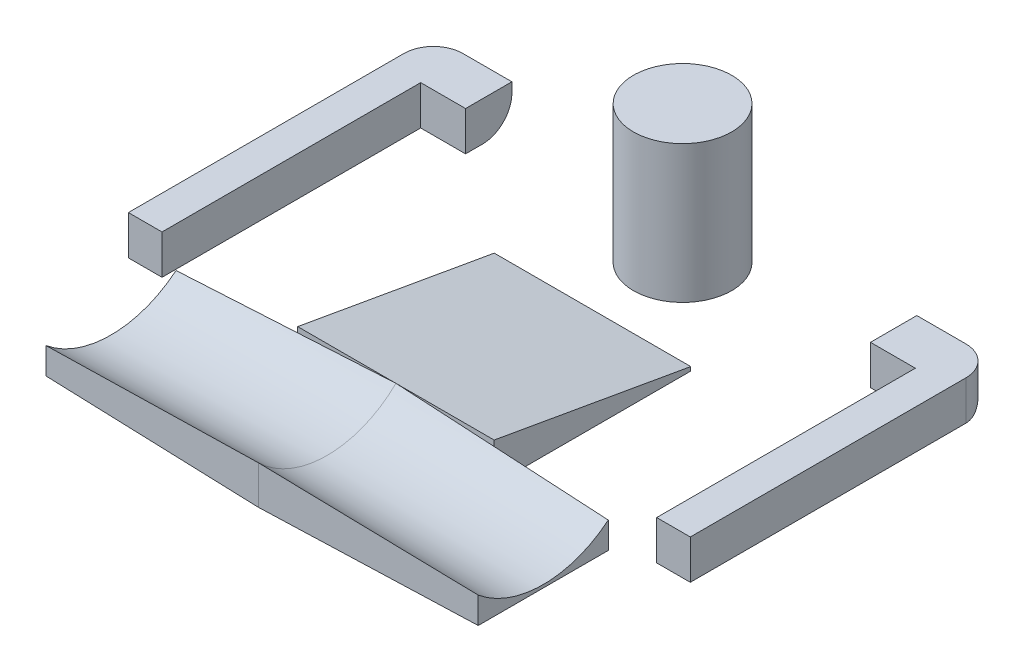
ISO-10303-21;
HEADER;
FILE_DESCRIPTION(('STEP AP214'),'2;1');
FILE_NAME('part.step','',(''),(''),'','','');
FILE_SCHEMA(('AUTOMOTIVE_DESIGN { 1 0 10303 214 1 1 1 1 }'));
ENDSEC;
DATA;
#1=APPLICATION_CONTEXT('core data for automotive mechanical design processes');
#2=APPLICATION_PROTOCOL_DEFINITION('international standard','automotive_design',2000,#1);
#3=PRODUCT_CONTEXT('',#1,'mechanical');
#4=PRODUCT('Part','Part','',(#3));
#5=PRODUCT_RELATED_PRODUCT_CATEGORY('part','',(#4));
#6=PRODUCT_DEFINITION_FORMATION('','',#4);
#7=PRODUCT_DEFINITION_CONTEXT('part definition',#1,'design');
#8=PRODUCT_DEFINITION('design','',#6,#7);
#9=PRODUCT_DEFINITION_SHAPE('','',#8);
#10=(LENGTH_UNIT() NAMED_UNIT(*) SI_UNIT(.MILLI.,.METRE.));
#11=(NAMED_UNIT(*) PLANE_ANGLE_UNIT() SI_UNIT($,.RADIAN.));
#12=(NAMED_UNIT(*) SI_UNIT($,.STERADIAN.) SOLID_ANGLE_UNIT());
#13=UNCERTAINTY_MEASURE_WITH_UNIT(LENGTH_MEASURE(1.E-05),#10,'distance_accuracy_value','');
#14=(GEOMETRIC_REPRESENTATION_CONTEXT(3) GLOBAL_UNCERTAINTY_ASSIGNED_CONTEXT((#13)) GLOBAL_UNIT_ASSIGNED_CONTEXT((#10,
#11,#12)) REPRESENTATION_CONTEXT('',''));
#15=CARTESIAN_POINT('',(0.,0.,0.));
#16=DIRECTION('',(0.,0.,1.));
#17=DIRECTION('',(1.,0.,0.));
#18=AXIS2_PLACEMENT_3D('',#15,#16,#17);
#19=CARTESIAN_POINT('',(0.,19.6439911719342,-86.2522820777331));
#20=DIRECTION('',(-0.0174524064372835,0.,-0.999847695156391));
#21=DIRECTION('',(-0.999847695156391,0.,0.0174524064372835));
#22=AXIS2_PLACEMENT_3D('',#19,#20,#21);
#23=PLANE('',#22);
#24=DIRECTION('',(0.,1.,0.));
#25=VECTOR('',#24,1.);
#26=CARTESIAN_POINT('',(0.,19.6439911719342,-86.2522820777331));
#27=LINE('',#26,#25);
#28=CARTESIAN_POINT('',(0.,0.,-86.2522820777331));
#29=VERTEX_POINT('',#28);
#30=CARTESIAN_POINT('',(0.,19.6439911719342,-86.2522820777331));
#31=VERTEX_POINT('',#30);
#32=EDGE_CURVE('E111',#29,#31,#27,.T.);
#33=ORIENTED_EDGE('',*,*,#32,.F.);
#34=DIRECTION('',(0.999695459881887,-0.0174497491606827,-0.0174497491606827));
#35=VECTOR('',#34,1.);
#36=CARTESIAN_POINT('',(0.,0.,-86.2522820777331));
#37=LINE('',#36,#35);
#38=CARTESIAN_POINT('',(-110.,1.92005714210394,-84.3322249356291));
#39=VERTEX_POINT('',#38);
#40=EDGE_CURVE('E12',#39,#29,#37,.T.);
#41=ORIENTED_EDGE('',*,*,#40,.F.);
#42=DIRECTION('',(0.,1.,0.));
#43=VECTOR('',#42,1.);
#44=CARTESIAN_POINT('',(-110.,55.3414805364965,-84.3322249356291));
#45=LINE('',#44,#43);
#46=CARTESIAN_POINT('',(-110.,15.3320033173084,-84.3322249356291));
#47=VERTEX_POINT('',#46);
#48=EDGE_CURVE('E134',#39,#47,#45,.T.);
#49=ORIENTED_EDGE('',*,*,#48,.T.);
#50=CARTESIAN_POINT('',(-110.,15.3320033173084,-84.3322249356291));
#51=CARTESIAN_POINT('',(-100.832584284601,15.6720161374856,-84.4922427721654));
#52=CARTESIAN_POINT('',(-91.6653270800063,16.0163249939476,-84.6522578418853));
#53=CARTESIAN_POINT('',(-73.3311807847771,16.7143120486609,-84.9722815558719));
#54=CARTESIAN_POINT('',(-64.1642916937,17.0679902352812,-85.1322902001464));
#55=CARTESIAN_POINT('',(-45.8309090448973,17.7854940955446,-85.4523005846352));
#56=CARTESIAN_POINT('',(-36.6644154872111,18.1493197701983,-85.6123023248487));
#57=CARTESIAN_POINT('',(-18.331864767641,18.8880818308203,-85.9322981879586));
#58=CARTESIAN_POINT('',(-9.16580760631306,19.2630182305842,-86.0922923108453));
#59=CARTESIAN_POINT('',(0.,19.6439911719342,-86.2522820777331));
#60=B_SPLINE_CURVE_WITH_KNOTS('',3,(#50,#51,#52,#53,#54,#55,#56,#57,#58,#59),.UNSPECIFIED.,.F.,
.F.,(4,2,2,2,4),(0.,27.5253434774323,55.0506527865783,82.5759648373009,110.101311066293),.UNSPECIFIED.);
#61=EDGE_CURVE('E89',#47,#31,#60,.T.);
#62=ORIENTED_EDGE('',*,*,#61,.T.);
#63=EDGE_LOOP('',(#33,#41,#49,#62));
#64=FACE_BOUND('',#63,.T.);
#65=ADVANCED_FACE('F52',(#64),#23,.T.);
#66=CARTESIAN_POINT('',(0.,0.,-86.2522820777331));
#67=DIRECTION('',(-0.0174524064372835,-0.999847695156391,0.));
#68=DIRECTION('',(0.999847695156391,-0.0174524064372835,0.));
#69=AXIS2_PLACEMENT_3D('',#66,#67,#68);
#70=PLANE('',#69);
#71=DIRECTION('',(0.,0.,-1.));
#72=VECTOR('',#71,1.);
#73=CARTESIAN_POINT('',(0.,0.,-86.2522820777331));
#74=LINE('',#73,#72);
#75=CARTESIAN_POINT('',(0.,0.,-16.23259190227));
#76=VERTEX_POINT('',#75);
#77=EDGE_CURVE('E121',#76,#29,#74,.T.);
#78=ORIENTED_EDGE('',*,*,#77,.F.);
#79=DIRECTION('',(0.999695459881887,-0.0174497491606827,0.0174497491606827));
#80=VECTOR('',#79,1.);
#81=CARTESIAN_POINT('',(0.,0.,-16.23259190227));
#82=LINE('',#81,#80);
#83=CARTESIAN_POINT('',(-110.,1.92005714210393,-18.1526490443739));
#84=VERTEX_POINT('',#83);
#85=EDGE_CURVE('E62',#84,#76,#82,.T.);
#86=ORIENTED_EDGE('',*,*,#85,.F.);
#87=DIRECTION('',(0.,0.,-1.));
#88=VECTOR('',#87,1.);
#89=CARTESIAN_POINT('',(-110.,1.92005714210394,-51.2424369900015));
#90=LINE('',#89,#88);
#91=EDGE_CURVE('E124',#84,#39,#90,.T.);
#92=ORIENTED_EDGE('',*,*,#91,.T.);
#93=ORIENTED_EDGE('',*,*,#40,.T.);
#94=EDGE_LOOP('',(#78,#86,#92,#93));
#95=FACE_BOUND('',#94,.T.);
#96=ADVANCED_FACE('F54',(#95),#70,.T.);
#97=CARTESIAN_POINT('',(0.,0.,-16.23259190227));
#98=DIRECTION('',(-0.0174524064372835,0.,0.999847695156391));
#99=DIRECTION('',(0.999847695156391,0.,0.0174524064372835));
#100=AXIS2_PLACEMENT_3D('',#97,#98,#99);
#101=PLANE('',#100);
#102=DIRECTION('',(0.,-1.,0.));
#103=VECTOR('',#102,1.);
#104=CARTESIAN_POINT('',(0.,0.,-16.23259190227));
#105=LINE('',#104,#103);
#106=CARTESIAN_POINT('',(0.,19.6439911719342,-16.23259190227));
#107=VERTEX_POINT('',#106);
#108=EDGE_CURVE('E135',#107,#76,#105,.T.);
#109=ORIENTED_EDGE('',*,*,#108,.F.);
#110=CARTESIAN_POINT('',(-110.,15.3320033173084,-18.1526490443739));
#111=CARTESIAN_POINT('',(-100.832584284601,15.6720161374856,-17.9926312078377));
#112=CARTESIAN_POINT('',(-91.6653270800063,16.0163249939476,-17.8326161381178));
#113=CARTESIAN_POINT('',(-73.3311807847771,16.7143120486609,-17.5125924241311));
#114=CARTESIAN_POINT('',(-64.1642916937,17.0679902352812,-17.3525837798566));
#115=CARTESIAN_POINT('',(-45.8309090448973,17.7854940955445,-17.0325733953679));
#116=CARTESIAN_POINT('',(-36.6644154872111,18.1493197701983,-16.8725716551544));
#117=CARTESIAN_POINT('',(-18.331864767641,18.8880818308203,-16.5525757920445));
#118=CARTESIAN_POINT('',(-9.16580760631306,19.2630182305842,-16.3925816691577));
#119=CARTESIAN_POINT('',(0.,19.6439911719342,-16.23259190227));
#120=B_SPLINE_CURVE_WITH_KNOTS('',3,(#110,#111,#112,#113,#114,#115,#116,#117,#118,#119),
.UNSPECIFIED.,.F.,.F.,(4,2,2,2,4),(0.,27.5253434774323,55.0506527865783,82.5759648373009,
110.101311066293),.UNSPECIFIED.);
#121=CARTESIAN_POINT('',(-110.,15.3320033173084,-18.1526490443739));
#122=VERTEX_POINT('',#121);
#123=EDGE_CURVE('E82',#122,#107,#120,.T.);
#124=ORIENTED_EDGE('',*,*,#123,.F.);
#125=DIRECTION('',(0.,-1.,0.));
#126=VECTOR('',#125,1.);
#127=CARTESIAN_POINT('',(-110.,55.3414805364965,-18.1526490443739));
#128=LINE('',#127,#126);
#129=EDGE_CURVE('E295',#122,#84,#128,.T.);
#130=ORIENTED_EDGE('',*,*,#129,.T.);
#131=ORIENTED_EDGE('',*,*,#85,.T.);
#132=EDGE_LOOP('',(#109,#124,#130,#131));
#133=FACE_BOUND('',#132,.T.);
#134=ADVANCED_FACE('F186',(#133),#101,.T.);
#135=CARTESIAN_POINT('',(0.,55.3414805364965,-51.2424369900015));
#136=DIRECTION('',(-1.,0.,0.));
#137=DIRECTION('',(0.,0.,-1.));
#138=AXIS2_PLACEMENT_3D('',#135,#136,#137);
#139=CONICAL_SURFACE('',#138,50.,0.0174532925199433);
#140=CARTESIAN_POINT('',(0.,55.3414805364965,-51.2424369900015));
#141=DIRECTION('',(-1.,0.,0.));
#142=DIRECTION('',(0.,0.,-1.));
#143=AXIS2_PLACEMENT_3D('',#140,#141,#142);
#144=CIRCLE('',#143,50.);
#145=EDGE_CURVE('E115',#31,#107,#144,.T.);
#146=ORIENTED_EDGE('',*,*,#145,.F.);
#147=ORIENTED_EDGE('',*,*,#61,.F.);
#148=CARTESIAN_POINT('',(-110.,55.3414805364965,-51.2424369900015));
#149=DIRECTION('',(1.,0.,0.));
#150=DIRECTION('',(0.,0.,-1.));
#151=AXIS2_PLACEMENT_3D('',#148,#149,#150);
#152=CIRCLE('',#151,51.9200571421039);
#153=EDGE_CURVE('E56',#47,#122,#152,.F.);
#154=ORIENTED_EDGE('',*,*,#153,.T.);
#155=ORIENTED_EDGE('',*,*,#123,.T.);
#156=EDGE_LOOP('',(#146,#147,#154,#155));
#157=FACE_BOUND('',#156,.T.);
#158=ADVANCED_FACE('F178',(#157),#139,.F.);
#159=CARTESIAN_POINT('',(-110.,55.3414805364965,-51.2424369900015));
#160=DIRECTION('',(1.,0.,0.));
#161=DIRECTION('',(0.,0.,-1.));
#162=AXIS2_PLACEMENT_3D('',#159,#160,#161);
#163=PLANE('',#162);
#164=ORIENTED_EDGE('',*,*,#48,.F.);
#165=ORIENTED_EDGE('',*,*,#91,.F.);
#166=ORIENTED_EDGE('',*,*,#129,.F.);
#167=ORIENTED_EDGE('',*,*,#153,.F.);
#168=EDGE_LOOP('',(#164,#165,#166,#167));
#169=FACE_BOUND('',#168,.T.);
#170=ADVANCED_FACE('F174',(#169),#163,.F.);
#171=CARTESIAN_POINT('',(0.,19.6439911719342,-86.2522820777331));
#172=DIRECTION('',(0.0174524064372835,0.,-0.999847695156391));
#173=DIRECTION('',(-0.999847695156391,0.,-0.0174524064372835));
#174=AXIS2_PLACEMENT_3D('',#171,#172,#173);
#175=PLANE('',#174);
#176=ORIENTED_EDGE('',*,*,#32,.T.);
#177=CARTESIAN_POINT('',(110.,15.3320033173084,-84.3322249356291));
#178=CARTESIAN_POINT('',(100.832584284601,15.6720161374856,-84.4922427721654));
#179=CARTESIAN_POINT('',(91.6653270800063,16.0163249939476,-84.6522578418853));
#180=CARTESIAN_POINT('',(73.3311807847771,16.7143120486609,-84.9722815558719));
#181=CARTESIAN_POINT('',(64.1642916937,17.0679902352812,-85.1322902001464));
#182=CARTESIAN_POINT('',(45.8309090448973,17.7854940955446,-85.4523005846352));
#183=CARTESIAN_POINT('',(36.6644154872111,18.1493197701983,-85.6123023248487));
#184=CARTESIAN_POINT('',(18.331864767641,18.8880818308203,-85.9322981879586));
#185=CARTESIAN_POINT('',(9.16580760631306,19.2630182305842,-86.0922923108453));
#186=CARTESIAN_POINT('',(0.,19.6439911719342,-86.2522820777331));
#187=B_SPLINE_CURVE_WITH_KNOTS('',3,(#177,#178,#179,#180,#181,#182,#183,#184,#185,#186),
.UNSPECIFIED.,.F.,.F.,(4,2,2,2,4),(0.,27.5253434774323,55.0506527865783,82.5759648373009,
110.101311066293),.UNSPECIFIED.);
#188=CARTESIAN_POINT('',(110.,15.3320033173084,-84.3322249356291));
#189=VERTEX_POINT('',#188);
#190=EDGE_CURVE('E116',#189,#31,#187,.T.);
#191=ORIENTED_EDGE('',*,*,#190,.F.);
#192=DIRECTION('',(0.,-1.,0.));
#193=VECTOR('',#192,1.);
#194=CARTESIAN_POINT('',(110.,19.6439911719342,-84.3322249356291));
#195=LINE('',#194,#193);
#196=CARTESIAN_POINT('',(110.,1.92005714210394,-84.3322249356291));
#197=VERTEX_POINT('',#196);
#198=EDGE_CURVE('E139',#197,#189,#195,.F.);
#199=ORIENTED_EDGE('',*,*,#198,.F.);
#200=DIRECTION('',(-0.999695459881887,-0.0174497491606827,-0.0174497491606827));
#201=VECTOR('',#200,1.);
#202=CARTESIAN_POINT('',(0.34267832737535,0.00598147245383165,-86.2463006052792));
#203=LINE('',#202,#201);
#204=EDGE_CURVE('E130',#197,#29,#203,.T.);
#205=ORIENTED_EDGE('',*,*,#204,.T.);
#206=EDGE_LOOP('',(#176,#191,#199,#205));
#207=FACE_BOUND('',#206,.T.);
#208=ADVANCED_FACE('F137',(#207),#175,.T.);
#209=CARTESIAN_POINT('',(0.,55.3414805364965,-51.2424369900015));
#210=DIRECTION('',(1.,0.,0.));
#211=DIRECTION('',(0.,0.,-1.));
#212=AXIS2_PLACEMENT_3D('',#209,#210,#211);
#213=CONICAL_SURFACE('',#212,50.,0.0174532925199433);
#214=ORIENTED_EDGE('',*,*,#145,.T.);
#215=CARTESIAN_POINT('',(110.,15.3320033173084,-18.1526490443739));
#216=CARTESIAN_POINT('',(100.832584284601,15.6720161374856,-17.9926312078377));
#217=CARTESIAN_POINT('',(91.6653270800063,16.0163249939476,-17.8326161381178));
#218=CARTESIAN_POINT('',(73.3311807847771,16.7143120486609,-17.5125924241311));
#219=CARTESIAN_POINT('',(64.1642916937,17.0679902352812,-17.3525837798566));
#220=CARTESIAN_POINT('',(45.8309090448973,17.7854940955445,-17.0325733953679));
#221=CARTESIAN_POINT('',(36.6644154872111,18.1493197701983,-16.8725716551544));
#222=CARTESIAN_POINT('',(18.331864767641,18.8880818308203,-16.5525757920445));
#223=CARTESIAN_POINT('',(9.16580760631306,19.2630182305842,-16.3925816691577));
#224=CARTESIAN_POINT('',(0.,19.6439911719342,-16.23259190227));
#225=B_SPLINE_CURVE_WITH_KNOTS('',3,(#215,#216,#217,#218,#219,#220,#221,#222,#223,#224),
.UNSPECIFIED.,.F.,.F.,(4,2,2,2,4),(0.,27.5253434774323,55.0506527865783,82.5759648373009,
110.101311066293),.UNSPECIFIED.);
#226=CARTESIAN_POINT('',(110.,15.3320033173084,-18.1526490443739));
#227=VERTEX_POINT('',#226);
#228=EDGE_CURVE('E142',#227,#107,#225,.T.);
#229=ORIENTED_EDGE('',*,*,#228,.F.);
#230=CARTESIAN_POINT('',(110.,55.3414805364965,-51.2424369900015));
#231=DIRECTION('',(1.,0.,0.));
#232=DIRECTION('',(0.,0.,-1.));
#233=AXIS2_PLACEMENT_3D('',#230,#231,#232);
#234=CIRCLE('',#233,51.9200571421039);
#235=EDGE_CURVE('E215',#189,#227,#234,.F.);
#236=ORIENTED_EDGE('',*,*,#235,.F.);
#237=ORIENTED_EDGE('',*,*,#190,.T.);
#238=EDGE_LOOP('',(#214,#229,#236,#237));
#239=FACE_BOUND('',#238,.T.);
#240=ADVANCED_FACE('F165',(#239),#213,.F.);
#241=CARTESIAN_POINT('',(0.,0.,-16.23259190227));
#242=DIRECTION('',(0.0174524064372835,0.,0.999847695156391));
#243=DIRECTION('',(0.999847695156391,0.,-0.0174524064372835));
#244=AXIS2_PLACEMENT_3D('',#241,#242,#243);
#245=PLANE('',#244);
#246=ORIENTED_EDGE('',*,*,#108,.T.);
#247=DIRECTION('',(-0.999695459881887,-0.0174497491606827,0.0174497491606827));
#248=VECTOR('',#247,1.);
#249=CARTESIAN_POINT('',(1.2214539348271,0.0213205577392253,-16.2539124600092));
#250=LINE('',#249,#248);
#251=CARTESIAN_POINT('',(110.,1.92005714210393,-18.1526490443739));
#252=VERTEX_POINT('',#251);
#253=EDGE_CURVE('E133',#252,#76,#250,.T.);
#254=ORIENTED_EDGE('',*,*,#253,.F.);
#255=DIRECTION('',(0.,1.,0.));
#256=VECTOR('',#255,1.);
#257=CARTESIAN_POINT('',(110.,0.,-18.1526490443739));
#258=LINE('',#257,#256);
#259=EDGE_CURVE('E144',#227,#252,#258,.F.);
#260=ORIENTED_EDGE('',*,*,#259,.F.);
#261=ORIENTED_EDGE('',*,*,#228,.T.);
#262=EDGE_LOOP('',(#246,#254,#260,#261));
#263=FACE_BOUND('',#262,.T.);
#264=ADVANCED_FACE('F162',(#263),#245,.T.);
#265=CARTESIAN_POINT('',(0.,0.,-86.2522820777331));
#266=DIRECTION('',(0.0174524064372835,-0.999847695156391,0.));
#267=DIRECTION('',(0.999847695156391,0.0174524064372835,0.));
#268=AXIS2_PLACEMENT_3D('',#265,#266,#267);
#269=PLANE('',#268);
#270=ORIENTED_EDGE('',*,*,#77,.T.);
#271=ORIENTED_EDGE('',*,*,#204,.F.);
#272=DIRECTION('',(0.,0.,1.));
#273=VECTOR('',#272,1.);
#274=CARTESIAN_POINT('',(110.,1.92005714210394,-86.2522820777331));
#275=LINE('',#274,#273);
#276=EDGE_CURVE('E140',#252,#197,#275,.F.);
#277=ORIENTED_EDGE('',*,*,#276,.F.);
#278=ORIENTED_EDGE('',*,*,#253,.T.);
#279=EDGE_LOOP('',(#270,#271,#277,#278));
#280=FACE_BOUND('',#279,.T.);
#281=ADVANCED_FACE('F128',(#280),#269,.T.);
#282=CARTESIAN_POINT('',(110.,55.3414805364965,-51.2424369900015));
#283=DIRECTION('',(1.,0.,0.));
#284=DIRECTION('',(0.,0.,-1.));
#285=AXIS2_PLACEMENT_3D('',#282,#283,#284);
#286=PLANE('',#285);
#287=ORIENTED_EDGE('',*,*,#198,.T.);
#288=ORIENTED_EDGE('',*,*,#235,.T.);
#289=ORIENTED_EDGE('',*,*,#259,.T.);
#290=ORIENTED_EDGE('',*,*,#276,.T.);
#291=EDGE_LOOP('',(#287,#288,#289,#290));
#292=FACE_BOUND('',#291,.T.);
#293=ADVANCED_FACE('F170',(#292),#286,.T.);
#294=CLOSED_SHELL('',(#65,#96,#134,#158,#170,#208,#240,#264,#281,#293));
#295=MANIFOLD_SOLID_BREP('B2',#294);
#296=CARTESIAN_POINT('',(0.,70.,-232.151552464465));
#297=DIRECTION('',(0.,-1.,0.));
#298=DIRECTION('',(0.,0.,-1.));
#299=AXIS2_PLACEMENT_3D('',#296,#297,#298);
#300=CYLINDRICAL_SURFACE('',#299,25.);
#301=CARTESIAN_POINT('',(0.,70.,-232.151552464465));
#302=DIRECTION('',(0.,1.,0.));
#303=DIRECTION('',(0.,0.,1.));
#304=AXIS2_PLACEMENT_3D('',#301,#302,#303);
#305=CIRCLE('',#304,25.);
#306=CARTESIAN_POINT('',(0.,70.,-207.151552464465));
#307=VERTEX_POINT('',#306);
#308=EDGE_CURVE('E51',#307,#307,#305,.T.);
#309=ORIENTED_EDGE('',*,*,#308,.F.);
#310=EDGE_LOOP('',(#309));
#311=FACE_BOUND('',#310,.T.);
#312=CARTESIAN_POINT('',(0.,0.,-232.151552464465));
#313=DIRECTION('',(0.,1.,0.));
#314=DIRECTION('',(0.,0.,1.));
#315=AXIS2_PLACEMENT_3D('',#312,#313,#314);
#316=CIRCLE('',#315,25.);
#317=CARTESIAN_POINT('',(0.,0.,-207.151552464465));
#318=VERTEX_POINT('',#317);
#319=EDGE_CURVE('E312',#318,#318,#316,.T.);
#320=ORIENTED_EDGE('',*,*,#319,.T.);
#321=EDGE_LOOP('',(#320));
#322=FACE_BOUND('',#321,.T.);
#323=ADVANCED_FACE('F309',(#311,#322),#300,.T.);
#324=CARTESIAN_POINT('',(0.,70.,0.));
#325=DIRECTION('',(0.,1.,0.));
#326=DIRECTION('',(0.,0.,1.));
#327=AXIS2_PLACEMENT_3D('',#324,#325,#326);
#328=PLANE('',#327);
#329=ORIENTED_EDGE('',*,*,#308,.T.);
#330=EDGE_LOOP('',(#329));
#331=FACE_BOUND('',#330,.T.);
#332=ADVANCED_FACE('F326',(#331),#328,.T.);
#333=CARTESIAN_POINT('',(0.,0.,0.));
#334=DIRECTION('',(0.,1.,0.));
#335=DIRECTION('',(0.,0.,1.));
#336=AXIS2_PLACEMENT_3D('',#333,#334,#335);
#337=PLANE('',#336);
#338=ORIENTED_EDGE('',*,*,#319,.F.);
#339=EDGE_LOOP('',(#338));
#340=FACE_BOUND('',#339,.T.);
#341=ADVANCED_FACE('F324',(#340),#337,.F.);
#342=CLOSED_SHELL('',(#323,#332,#341));
#343=MANIFOLD_SOLID_BREP('B6',#342);
#344=CARTESIAN_POINT('',(50.,0.,-186.316328436623));
#345=DIRECTION('',(0.,0.,1.));
#346=DIRECTION('',(1.,0.,0.));
#347=AXIS2_PLACEMENT_3D('',#344,#345,#346);
#348=PLANE('',#347);
#349=DIRECTION('',(0.,1.,0.));
#350=VECTOR('',#349,1.);
#351=CARTESIAN_POINT('',(-50.,0.,-186.316328436623));
#352=LINE('',#351,#350);
#353=CARTESIAN_POINT('',(-50.,0.,-186.316328436623));
#354=VERTEX_POINT('',#353);
#355=CARTESIAN_POINT('',(-50.,2.,-186.316328436623));
#356=VERTEX_POINT('',#355);
#357=EDGE_CURVE('E430',#354,#356,#352,.T.);
#358=ORIENTED_EDGE('',*,*,#357,.T.);
#359=DIRECTION('',(-1.,0.,0.));
#360=VECTOR('',#359,1.);
#361=CARTESIAN_POINT('',(50.,2.,-186.316328436623));
#362=LINE('',#361,#360);
#363=CARTESIAN_POINT('',(50.,2.,-186.316328436623));
#364=VERTEX_POINT('',#363);
#365=EDGE_CURVE('E307',#364,#356,#362,.T.);
#366=ORIENTED_EDGE('',*,*,#365,.F.);
#367=DIRECTION('',(0.,1.,0.));
#368=VECTOR('',#367,1.);
#369=CARTESIAN_POINT('',(50.,0.,-186.316328436623));
#370=LINE('',#369,#368);
#371=CARTESIAN_POINT('',(50.,0.,-186.316328436623));
#372=VERTEX_POINT('',#371);
#373=EDGE_CURVE('E416',#372,#364,#370,.T.);
#374=ORIENTED_EDGE('',*,*,#373,.F.);
#375=DIRECTION('',(-1.,0.,0.));
#376=VECTOR('',#375,1.);
#377=CARTESIAN_POINT('',(50.,0.,-186.316328436623));
#378=LINE('',#377,#376);
#379=EDGE_CURVE('E426',#372,#354,#378,.T.);
#380=ORIENTED_EDGE('',*,*,#379,.T.);
#381=EDGE_LOOP('',(#358,#366,#374,#380));
#382=FACE_BOUND('',#381,.T.);
#383=ADVANCED_FACE('F368',(#382),#348,.F.);
#384=CARTESIAN_POINT('',(50.,2.,-186.316328436623));
#385=DIRECTION('',(0.,-0.984807753012209,0.173648177666923));
#386=DIRECTION('',(0.,-0.173648177666923,-0.984807753012209));
#387=AXIS2_PLACEMENT_3D('',#384,#385,#386);
#388=PLANE('',#387);
#389=DIRECTION('',(0.,0.173648177666923,0.984807753012209));
#390=VECTOR('',#389,1.);
#391=CARTESIAN_POINT('',(-50.,2.,-186.316328436623));
#392=LINE('',#391,#390);
#393=CARTESIAN_POINT('',(-50.,19.6439911719342,-86.2522820777331));
#394=VERTEX_POINT('',#393);
#395=EDGE_CURVE('E421',#356,#394,#392,.T.);
#396=ORIENTED_EDGE('',*,*,#395,.T.);
#397=DIRECTION('',(-1.,0.,0.));
#398=VECTOR('',#397,1.);
#399=CARTESIAN_POINT('',(50.,19.6439911719342,-86.2522820777331));
#400=LINE('',#399,#398);
#401=CARTESIAN_POINT('',(50.,19.6439911719342,-86.2522820777331));
#402=VERTEX_POINT('',#401);
#403=EDGE_CURVE('E376',#402,#394,#400,.T.);
#404=ORIENTED_EDGE('',*,*,#403,.F.);
#405=DIRECTION('',(0.,0.173648177666923,0.984807753012209));
#406=VECTOR('',#405,1.);
#407=CARTESIAN_POINT('',(50.,2.,-186.316328436623));
#408=LINE('',#407,#406);
#409=EDGE_CURVE('E411',#364,#402,#408,.T.);
#410=ORIENTED_EDGE('',*,*,#409,.F.);
#411=ORIENTED_EDGE('',*,*,#365,.T.);
#412=EDGE_LOOP('',(#396,#404,#410,#411));
#413=FACE_BOUND('',#412,.T.);
#414=ADVANCED_FACE('F420',(#413),#388,.F.);
#415=CARTESIAN_POINT('',(50.,19.6439911719342,-86.2522820777331));
#416=DIRECTION('',(0.,0.,-1.));
#417=DIRECTION('',(-1.,0.,0.));
#418=AXIS2_PLACEMENT_3D('',#415,#416,#417);
#419=PLANE('',#418);
#420=DIRECTION('',(0.,-1.,0.));
#421=VECTOR('',#420,1.);
#422=CARTESIAN_POINT('',(-50.,19.6439911719342,-86.2522820777331));
#423=LINE('',#422,#421);
#424=CARTESIAN_POINT('',(-50.,0.,-86.2522820777331));
#425=VERTEX_POINT('',#424);
#426=EDGE_CURVE('E434',#394,#425,#423,.T.);
#427=ORIENTED_EDGE('',*,*,#426,.T.);
#428=DIRECTION('',(-1.,0.,0.));
#429=VECTOR('',#428,1.);
#430=CARTESIAN_POINT('',(50.,0.,-86.2522820777331));
#431=LINE('',#430,#429);
#432=CARTESIAN_POINT('',(50.,0.,-86.2522820777331));
#433=VERTEX_POINT('',#432);
#434=EDGE_CURVE('E400',#433,#425,#431,.T.);
#435=ORIENTED_EDGE('',*,*,#434,.F.);
#436=DIRECTION('',(0.,-1.,0.));
#437=VECTOR('',#436,1.);
#438=CARTESIAN_POINT('',(50.,19.6439911719342,-86.2522820777331));
#439=LINE('',#438,#437);
#440=EDGE_CURVE('E414',#402,#433,#439,.T.);
#441=ORIENTED_EDGE('',*,*,#440,.F.);
#442=ORIENTED_EDGE('',*,*,#403,.T.);
#443=EDGE_LOOP('',(#427,#435,#441,#442));
#444=FACE_BOUND('',#443,.T.);
#445=ADVANCED_FACE('F424',(#444),#419,.F.);
#446=CARTESIAN_POINT('',(50.,0.,-86.2522820777331));
#447=DIRECTION('',(0.,1.,0.));
#448=DIRECTION('',(0.,0.,1.));
#449=AXIS2_PLACEMENT_3D('',#446,#447,#448);
#450=PLANE('',#449);
#451=DIRECTION('',(0.,0.,-1.));
#452=VECTOR('',#451,1.);
#453=CARTESIAN_POINT('',(-50.,0.,-86.2522820777331));
#454=LINE('',#453,#452);
#455=EDGE_CURVE('E404',#425,#354,#454,.T.);
#456=ORIENTED_EDGE('',*,*,#455,.T.);
#457=ORIENTED_EDGE('',*,*,#379,.F.);
#458=DIRECTION('',(0.,0.,-1.));
#459=VECTOR('',#458,1.);
#460=CARTESIAN_POINT('',(50.,0.,-86.2522820777331));
#461=LINE('',#460,#459);
#462=EDGE_CURVE('E384',#433,#372,#461,.T.);
#463=ORIENTED_EDGE('',*,*,#462,.F.);
#464=ORIENTED_EDGE('',*,*,#434,.T.);
#465=EDGE_LOOP('',(#456,#457,#463,#464));
#466=FACE_BOUND('',#465,.T.);
#467=ADVANCED_FACE('F447',(#466),#450,.F.);
#468=CARTESIAN_POINT('',(50.,0.,0.));
#469=DIRECTION('',(-1.,0.,0.));
#470=DIRECTION('',(0.,0.,1.));
#471=AXIS2_PLACEMENT_3D('',#468,#469,#470);
#472=PLANE('',#471);
#473=ORIENTED_EDGE('',*,*,#373,.T.);
#474=ORIENTED_EDGE('',*,*,#409,.T.);
#475=ORIENTED_EDGE('',*,*,#440,.T.);
#476=ORIENTED_EDGE('',*,*,#462,.T.);
#477=EDGE_LOOP('',(#473,#474,#475,#476));
#478=FACE_BOUND('',#477,.T.);
#479=ADVANCED_FACE('F412',(#478),#472,.F.);
#480=CARTESIAN_POINT('',(-50.,0.,0.));
#481=DIRECTION('',(-1.,0.,0.));
#482=DIRECTION('',(0.,0.,1.));
#483=AXIS2_PLACEMENT_3D('',#480,#481,#482);
#484=PLANE('',#483);
#485=ORIENTED_EDGE('',*,*,#357,.F.);
#486=ORIENTED_EDGE('',*,*,#455,.F.);
#487=ORIENTED_EDGE('',*,*,#426,.F.);
#488=ORIENTED_EDGE('',*,*,#395,.F.);
#489=EDGE_LOOP('',(#485,#486,#487,#488));
#490=FACE_BOUND('',#489,.T.);
#491=ADVANCED_FACE('F441',(#490),#484,.T.);
#492=CLOSED_SHELL('',(#383,#414,#445,#467,#479,#491));
#493=MANIFOLD_SOLID_BREP('B46',#492);
#494=CARTESIAN_POINT('',(125.885057368489,20.,0.));
#495=DIRECTION('',(1.,0.,0.));
#496=DIRECTION('',(0.,0.,-1.));
#497=AXIS2_PLACEMENT_3D('',#494,#495,#496);
#498=PLANE('',#497);
#499=DIRECTION('',(0.,0.,1.));
#500=VECTOR('',#499,1.);
#501=CARTESIAN_POINT('',(125.885057368489,0.,0.));
#502=LINE('',#501,#500);
#503=CARTESIAN_POINT('',(125.885057368489,0.,-224.743736792234));
#504=VERTEX_POINT('',#503);
#505=CARTESIAN_POINT('',(125.885057368489,0.,-93.088162206362));
#506=VERTEX_POINT('',#505);
#507=EDGE_CURVE('E593',#504,#506,#502,.T.);
#508=ORIENTED_EDGE('',*,*,#507,.T.);
#509=DIRECTION('',(0.,-1.,0.));
#510=VECTOR('',#509,1.);
#511=CARTESIAN_POINT('',(125.885057368489,20.,-93.088162206362));
#512=LINE('',#511,#510);
#513=CARTESIAN_POINT('',(125.885057368489,20.,-93.088162206362));
#514=VERTEX_POINT('',#513);
#515=EDGE_CURVE('E575',#514,#506,#512,.T.);
#516=ORIENTED_EDGE('',*,*,#515,.F.);
#517=DIRECTION('',(0.,0.,1.));
#518=VECTOR('',#517,1.);
#519=CARTESIAN_POINT('',(125.885057368489,20.,0.));
#520=LINE('',#519,#518);
#521=CARTESIAN_POINT('',(125.885057368489,20.,-224.743736792234));
#522=VERTEX_POINT('',#521);
#523=EDGE_CURVE('E581',#522,#514,#520,.T.);
#524=ORIENTED_EDGE('',*,*,#523,.F.);
#525=DIRECTION('',(0.,-1.,0.));
#526=VECTOR('',#525,1.);
#527=CARTESIAN_POINT('',(125.885057368489,20.,-224.743736792234));
#528=LINE('',#527,#526);
#529=EDGE_CURVE('E627',#522,#504,#528,.T.);
#530=ORIENTED_EDGE('',*,*,#529,.T.);
#531=EDGE_LOOP('',(#508,#516,#524,#530));
#532=FACE_BOUND('',#531,.T.);
#533=ADVANCED_FACE('F506',(#532),#498,.F.);
#534=CARTESIAN_POINT('',(0.,20.,-93.088162206362));
#535=DIRECTION('',(0.,0.,-1.));
#536=DIRECTION('',(-1.,0.,0.));
#537=AXIS2_PLACEMENT_3D('',#534,#535,#536);
#538=PLANE('',#537);
#539=DIRECTION('',(1.,0.,0.));
#540=VECTOR('',#539,1.);
#541=CARTESIAN_POINT('',(0.,0.,-93.088162206362));
#542=LINE('',#541,#540);
#543=CARTESIAN_POINT('',(143.0000000005,0.,-93.088162206362));
#544=VERTEX_POINT('',#543);
#545=EDGE_CURVE('E636',#506,#544,#542,.T.);
#546=ORIENTED_EDGE('',*,*,#545,.T.);
#547=DIRECTION('',(0.,-1.,0.));
#548=VECTOR('',#547,1.);
#549=CARTESIAN_POINT('',(143.0000000005,20.,-93.088162206362));
#550=LINE('',#549,#548);
#551=CARTESIAN_POINT('',(143.0000000005,20.,-93.088162206362));
#552=VERTEX_POINT('',#551);
#553=EDGE_CURVE('E578',#552,#544,#550,.T.);
#554=ORIENTED_EDGE('',*,*,#553,.F.);
#555=DIRECTION('',(1.,0.,0.));
#556=VECTOR('',#555,1.);
#557=CARTESIAN_POINT('',(0.,20.,-93.088162206362));
#558=LINE('',#557,#556);
#559=EDGE_CURVE('E570',#514,#552,#558,.T.);
#560=ORIENTED_EDGE('',*,*,#559,.F.);
#561=ORIENTED_EDGE('',*,*,#515,.T.);
#562=EDGE_LOOP('',(#546,#554,#560,#561));
#563=FACE_BOUND('',#562,.T.);
#564=ADVANCED_FACE('F573',(#563),#538,.F.);
#565=CARTESIAN_POINT('',(143.0000000005,20.,0.));
#566=DIRECTION('',(1.,0.,0.));
#567=DIRECTION('',(0.,0.,-1.));
#568=AXIS2_PLACEMENT_3D('',#565,#566,#567);
#569=PLANE('',#568);
#570=DIRECTION('',(0.,0.,1.));
#571=VECTOR('',#570,1.);
#572=CARTESIAN_POINT('',(143.0000000005,0.,0.));
#573=LINE('',#572,#571);
#574=CARTESIAN_POINT('',(143.0000000005,0.,-233.3310261243));
#575=VERTEX_POINT('',#574);
#576=EDGE_CURVE('E634',#575,#544,#573,.T.);
#577=ORIENTED_EDGE('',*,*,#576,.F.);
#578=DIRECTION('',(0.,-1.,0.));
#579=VECTOR('',#578,1.);
#580=CARTESIAN_POINT('',(143.0000000005,20.,-233.3310261243));
#581=LINE('',#580,#579);
#582=CARTESIAN_POINT('',(143.0000000005,20.,-233.3310261243));
#583=VERTEX_POINT('',#582);
#584=EDGE_CURVE('E529',#575,#583,#581,.F.);
#585=ORIENTED_EDGE('',*,*,#584,.T.);
#586=DIRECTION('',(0.,0.,1.));
#587=VECTOR('',#586,1.);
#588=CARTESIAN_POINT('',(143.0000000005,20.,0.));
#589=LINE('',#588,#587);
#590=EDGE_CURVE('E580',#583,#552,#589,.T.);
#591=ORIENTED_EDGE('',*,*,#590,.T.);
#592=ORIENTED_EDGE('',*,*,#553,.T.);
#593=EDGE_LOOP('',(#577,#585,#591,#592));
#594=FACE_BOUND('',#593,.T.);
#595=ADVANCED_FACE('F641',(#594),#569,.T.);
#596=CARTESIAN_POINT('',(0.,20.,-248.3310261243));
#597=DIRECTION('',(0.,0.,1.));
#598=DIRECTION('',(1.,0.,0.));
#599=AXIS2_PLACEMENT_3D('',#596,#597,#598);
#600=PLANE('',#599);
#601=DIRECTION('',(-1.,0.,0.));
#602=VECTOR('',#601,1.);
#603=CARTESIAN_POINT('',(0.,20.,-248.3310261243));
#604=LINE('',#603,#602);
#605=CARTESIAN_POINT('',(128.0000000005,20.,-248.3310261243));
#606=VERTEX_POINT('',#605);
#607=CARTESIAN_POINT('',(103.04729699611,20.,-248.3310261243));
#608=VERTEX_POINT('',#607);
#609=EDGE_CURVE('E609',#606,#608,#604,.T.);
#610=ORIENTED_EDGE('',*,*,#609,.F.);
#611=DIRECTION('',(0.,-1.,0.));
#612=VECTOR('',#611,1.);
#613=CARTESIAN_POINT('',(128.0000000005,0.,-248.3310261243));
#614=LINE('',#613,#612);
#615=CARTESIAN_POINT('',(128.0000000005,15.,-248.3310261243));
#616=VERTEX_POINT('',#615);
#617=EDGE_CURVE('E596',#606,#616,#614,.T.);
#618=ORIENTED_EDGE('',*,*,#617,.T.);
#619=DIRECTION('',(-1.,0.,0.));
#620=VECTOR('',#619,1.);
#621=CARTESIAN_POINT('',(0.,15.,-248.3310261243));
#622=LINE('',#621,#620);
#623=CARTESIAN_POINT('',(103.04729699611,15.,-248.3310261243));
#624=VERTEX_POINT('',#623);
#625=EDGE_CURVE('E594',#616,#624,#622,.T.);
#626=ORIENTED_EDGE('',*,*,#625,.T.);
#627=DIRECTION('',(0.,-1.,0.));
#628=VECTOR('',#627,1.);
#629=CARTESIAN_POINT('',(103.04729699611,20.,-248.3310261243));
#630=LINE('',#629,#628);
#631=EDGE_CURVE('E598',#608,#624,#630,.T.);
#632=ORIENTED_EDGE('',*,*,#631,.F.);
#633=EDGE_LOOP('',(#610,#618,#626,#632));
#634=FACE_BOUND('',#633,.T.);
#635=ADVANCED_FACE('F614',(#634),#600,.F.);
#636=CARTESIAN_POINT('',(103.04729699611,20.,0.));
#637=DIRECTION('',(1.,0.,0.));
#638=DIRECTION('',(0.,0.,-1.));
#639=AXIS2_PLACEMENT_3D('',#636,#637,#638);
#640=PLANE('',#639);
#641=ORIENTED_EDGE('',*,*,#631,.T.);
#642=CARTESIAN_POINT('',(103.04729699611,15.,-233.3310261243));
#643=DIRECTION('',(1.,0.,0.));
#644=DIRECTION('',(0.,0.,-1.));
#645=AXIS2_PLACEMENT_3D('',#642,#643,#644);
#646=CIRCLE('',#645,15.);
#647=CARTESIAN_POINT('',(103.04729699611,0.,-233.3310261243));
#648=VERTEX_POINT('',#647);
#649=EDGE_CURVE('E515',#624,#648,#646,.F.);
#650=ORIENTED_EDGE('',*,*,#649,.T.);
#651=DIRECTION('',(0.,0.,1.));
#652=VECTOR('',#651,1.);
#653=CARTESIAN_POINT('',(103.04729699611,0.,0.));
#654=LINE('',#653,#652);
#655=CARTESIAN_POINT('',(103.04729699611,0.,-224.743736792234));
#656=VERTEX_POINT('',#655);
#657=EDGE_CURVE('E632',#648,#656,#654,.T.);
#658=ORIENTED_EDGE('',*,*,#657,.T.);
#659=DIRECTION('',(0.,-1.,0.));
#660=VECTOR('',#659,1.);
#661=CARTESIAN_POINT('',(103.04729699611,20.,-224.743736792234));
#662=LINE('',#661,#660);
#663=CARTESIAN_POINT('',(103.04729699611,20.,-224.743736792234));
#664=VERTEX_POINT('',#663);
#665=EDGE_CURVE('E625',#664,#656,#662,.T.);
#666=ORIENTED_EDGE('',*,*,#665,.F.);
#667=DIRECTION('',(0.,0.,1.));
#668=VECTOR('',#667,1.);
#669=CARTESIAN_POINT('',(103.04729699611,20.,0.));
#670=LINE('',#669,#668);
#671=EDGE_CURVE('E616',#608,#664,#670,.T.);
#672=ORIENTED_EDGE('',*,*,#671,.F.);
#673=EDGE_LOOP('',(#641,#650,#658,#666,#672));
#674=FACE_BOUND('',#673,.T.);
#675=ADVANCED_FACE('F623',(#674),#640,.F.);
#676=CARTESIAN_POINT('',(0.,20.,-224.743736792234));
#677=DIRECTION('',(0.,0.,-1.));
#678=DIRECTION('',(-1.,0.,0.));
#679=AXIS2_PLACEMENT_3D('',#676,#677,#678);
#680=PLANE('',#679);
#681=DIRECTION('',(1.,0.,0.));
#682=VECTOR('',#681,1.);
#683=CARTESIAN_POINT('',(0.,0.,-224.743736792234));
#684=LINE('',#683,#682);
#685=EDGE_CURVE('E590',#656,#504,#684,.T.);
#686=ORIENTED_EDGE('',*,*,#685,.T.);
#687=ORIENTED_EDGE('',*,*,#529,.F.);
#688=DIRECTION('',(1.,0.,0.));
#689=VECTOR('',#688,1.);
#690=CARTESIAN_POINT('',(0.,20.,-224.743736792234));
#691=LINE('',#690,#689);
#692=EDGE_CURVE('E586',#664,#522,#691,.T.);
#693=ORIENTED_EDGE('',*,*,#692,.F.);
#694=ORIENTED_EDGE('',*,*,#665,.T.);
#695=EDGE_LOOP('',(#686,#687,#693,#694));
#696=FACE_BOUND('',#695,.T.);
#697=ADVANCED_FACE('F646',(#696),#680,.F.);
#698=CARTESIAN_POINT('',(0.,20.,0.));
#699=DIRECTION('',(0.,1.,0.));
#700=DIRECTION('',(0.,0.,1.));
#701=AXIS2_PLACEMENT_3D('',#698,#699,#700);
#702=PLANE('',#701);
#703=ORIENTED_EDGE('',*,*,#590,.F.);
#704=CARTESIAN_POINT('',(128.0000000005,20.,-233.3310261243));
#705=DIRECTION('',(0.,1.,0.));
#706=DIRECTION('',(0.,0.,1.));
#707=AXIS2_PLACEMENT_3D('',#704,#705,#706);
#708=CIRCLE('',#707,15.);
#709=EDGE_CURVE('E605',#583,#606,#708,.T.);
#710=ORIENTED_EDGE('',*,*,#709,.T.);
#711=ORIENTED_EDGE('',*,*,#609,.T.);
#712=ORIENTED_EDGE('',*,*,#671,.T.);
#713=ORIENTED_EDGE('',*,*,#692,.T.);
#714=ORIENTED_EDGE('',*,*,#523,.T.);
#715=ORIENTED_EDGE('',*,*,#559,.T.);
#716=EDGE_LOOP('',(#703,#710,#711,#712,#713,#714,#715));
#717=FACE_BOUND('',#716,.T.);
#718=ADVANCED_FACE('F584',(#717),#702,.T.);
#719=CARTESIAN_POINT('',(0.,0.,0.));
#720=DIRECTION('',(0.,1.,0.));
#721=DIRECTION('',(0.,0.,1.));
#722=AXIS2_PLACEMENT_3D('',#719,#720,#721);
#723=PLANE('',#722);
#724=ORIENTED_EDGE('',*,*,#657,.F.);
#725=DIRECTION('',(-1.,0.,0.));
#726=VECTOR('',#725,1.);
#727=CARTESIAN_POINT('',(0.,0.,-233.3310261243));
#728=LINE('',#727,#726);
#729=EDGE_CURVE('E366',#648,#575,#728,.F.);
#730=ORIENTED_EDGE('',*,*,#729,.T.);
#731=ORIENTED_EDGE('',*,*,#576,.T.);
#732=ORIENTED_EDGE('',*,*,#545,.F.);
#733=ORIENTED_EDGE('',*,*,#507,.F.);
#734=ORIENTED_EDGE('',*,*,#685,.F.);
#735=EDGE_LOOP('',(#724,#730,#731,#732,#733,#734));
#736=FACE_BOUND('',#735,.T.);
#737=ADVANCED_FACE('F643',(#736),#723,.F.);
#738=CARTESIAN_POINT('',(0.,15.,-233.3310261243));
#739=DIRECTION('',(-1.,0.,0.));
#740=DIRECTION('',(0.,0.,1.));
#741=AXIS2_PLACEMENT_3D('',#738,#739,#740);
#742=CYLINDRICAL_SURFACE('',#741,15.);
#743=ORIENTED_EDGE('',*,*,#649,.F.);
#744=ORIENTED_EDGE('',*,*,#625,.F.);
#745=CARTESIAN_POINT('',(128.0000000005,15.,-233.3310261243));
#746=DIRECTION('',(-0.707106781186547,-0.707106781186547,0.));
#747=DIRECTION('',(-0.707106781186547,0.707106781186547,0.));
#748=AXIS2_PLACEMENT_3D('',#745,#746,#747);
#749=ELLIPSE('',#748,21.2132034355964,15.);
#750=EDGE_CURVE('E510',#575,#616,#749,.F.);
#751=ORIENTED_EDGE('',*,*,#750,.F.);
#752=ORIENTED_EDGE('',*,*,#729,.F.);
#753=EDGE_LOOP('',(#743,#744,#751,#752));
#754=FACE_BOUND('',#753,.T.);
#755=ADVANCED_FACE('F508',(#754),#742,.T.);
#756=CARTESIAN_POINT('',(128.0000000005,20.,-233.3310261243));
#757=DIRECTION('',(0.,1.,0.));
#758=DIRECTION('',(0.,0.,1.));
#759=AXIS2_PLACEMENT_3D('',#756,#757,#758);
#760=CYLINDRICAL_SURFACE('',#759,15.);
#761=ORIENTED_EDGE('',*,*,#709,.F.);
#762=ORIENTED_EDGE('',*,*,#584,.F.);
#763=ORIENTED_EDGE('',*,*,#750,.T.);
#764=ORIENTED_EDGE('',*,*,#617,.F.);
#765=EDGE_LOOP('',(#761,#762,#763,#764));
#766=FACE_BOUND('',#765,.T.);
#767=ADVANCED_FACE('F618',(#766),#760,.T.);
#768=CLOSED_SHELL('',(#533,#564,#595,#635,#675,#697,#718,#737,#755,#767));
#769=MANIFOLD_SOLID_BREP('B301',#768);
#770=CARTESIAN_POINT('',(-143.0000000005,20.,0.));
#771=DIRECTION('',(1.,0.,0.));
#772=DIRECTION('',(0.,0.,-1.));
#773=AXIS2_PLACEMENT_3D('',#770,#771,#772);
#774=PLANE('',#773);
#775=DIRECTION('',(0.,0.,1.));
#776=VECTOR('',#775,1.);
#777=CARTESIAN_POINT('',(-143.0000000005,20.,0.));
#778=LINE('',#777,#776);
#779=CARTESIAN_POINT('',(-143.0000000005,20.,-233.3310261243));
#780=VERTEX_POINT('',#779);
#781=CARTESIAN_POINT('',(-143.0000000005,20.,-93.088162206362));
#782=VERTEX_POINT('',#781);
#783=EDGE_CURVE('E807',#780,#782,#778,.T.);
#784=ORIENTED_EDGE('',*,*,#783,.F.);
#785=DIRECTION('',(0.,-1.,0.));
#786=VECTOR('',#785,1.);
#787=CARTESIAN_POINT('',(-143.0000000005,0.,-233.3310261243));
#788=LINE('',#787,#786);
#789=CARTESIAN_POINT('',(-143.0000000005,0.,-233.3310261243));
#790=VERTEX_POINT('',#789);
#791=EDGE_CURVE('E756',#780,#790,#788,.T.);
#792=ORIENTED_EDGE('',*,*,#791,.T.);
#793=DIRECTION('',(0.,0.,1.));
#794=VECTOR('',#793,1.);
#795=CARTESIAN_POINT('',(-143.0000000005,0.,0.));
#796=LINE('',#795,#794);
#797=CARTESIAN_POINT('',(-143.0000000005,0.,-93.088162206362));
#798=VERTEX_POINT('',#797);
#799=EDGE_CURVE('E828',#790,#798,#796,.T.);
#800=ORIENTED_EDGE('',*,*,#799,.T.);
#801=DIRECTION('',(0.,-1.,0.));
#802=VECTOR('',#801,1.);
#803=CARTESIAN_POINT('',(-143.0000000005,20.,-93.088162206362));
#804=LINE('',#803,#802);
#805=EDGE_CURVE('E822',#782,#798,#804,.T.);
#806=ORIENTED_EDGE('',*,*,#805,.F.);
#807=EDGE_LOOP('',(#784,#792,#800,#806));
#808=FACE_BOUND('',#807,.T.);
#809=ADVANCED_FACE('F747',(#808),#774,.F.);
#810=CARTESIAN_POINT('',(0.,20.,-93.088162206362));
#811=DIRECTION('',(0.,0.,-1.));
#812=DIRECTION('',(-1.,0.,0.));
#813=AXIS2_PLACEMENT_3D('',#810,#811,#812);
#814=PLANE('',#813);
#815=DIRECTION('',(1.,0.,0.));
#816=VECTOR('',#815,1.);
#817=CARTESIAN_POINT('',(0.,0.,-93.088162206362));
#818=LINE('',#817,#816);
#819=CARTESIAN_POINT('',(-125.885057368489,0.,-93.088162206362));
#820=VERTEX_POINT('',#819);
#821=EDGE_CURVE('E850',#798,#820,#818,.T.);
#822=ORIENTED_EDGE('',*,*,#821,.T.);
#823=DIRECTION('',(0.,-1.,0.));
#824=VECTOR('',#823,1.);
#825=CARTESIAN_POINT('',(-125.885057368489,20.,-93.088162206362));
#826=LINE('',#825,#824);
#827=CARTESIAN_POINT('',(-125.885057368489,20.,-93.088162206362));
#828=VERTEX_POINT('',#827);
#829=EDGE_CURVE('E823',#828,#820,#826,.T.);
#830=ORIENTED_EDGE('',*,*,#829,.F.);
#831=DIRECTION('',(1.,0.,0.));
#832=VECTOR('',#831,1.);
#833=CARTESIAN_POINT('',(0.,20.,-93.088162206362));
#834=LINE('',#833,#832);
#835=EDGE_CURVE('E811',#782,#828,#834,.T.);
#836=ORIENTED_EDGE('',*,*,#835,.F.);
#837=ORIENTED_EDGE('',*,*,#805,.T.);
#838=EDGE_LOOP('',(#822,#830,#836,#837));
#839=FACE_BOUND('',#838,.T.);
#840=ADVANCED_FACE('F821',(#839),#814,.F.);
#841=CARTESIAN_POINT('',(-125.885057368489,20.,0.));
#842=DIRECTION('',(1.,0.,0.));
#843=DIRECTION('',(0.,0.,-1.));
#844=AXIS2_PLACEMENT_3D('',#841,#842,#843);
#845=PLANE('',#844);
#846=DIRECTION('',(0.,0.,1.));
#847=VECTOR('',#846,1.);
#848=CARTESIAN_POINT('',(-125.885057368489,0.,0.));
#849=LINE('',#848,#847);
#850=CARTESIAN_POINT('',(-125.885057368489,0.,-224.743736792234));
#851=VERTEX_POINT('',#850);
#852=EDGE_CURVE('E881',#851,#820,#849,.T.);
#853=ORIENTED_EDGE('',*,*,#852,.F.);
#854=DIRECTION('',(0.,-1.,0.));
#855=VECTOR('',#854,1.);
#856=CARTESIAN_POINT('',(-125.885057368489,20.,-224.743736792234));
#857=LINE('',#856,#855);
#858=CARTESIAN_POINT('',(-125.885057368489,20.,-224.743736792234));
#859=VERTEX_POINT('',#858);
#860=EDGE_CURVE('E835',#859,#851,#857,.T.);
#861=ORIENTED_EDGE('',*,*,#860,.F.);
#862=DIRECTION('',(0.,0.,1.));
#863=VECTOR('',#862,1.);
#864=CARTESIAN_POINT('',(-125.885057368489,20.,0.));
#865=LINE('',#864,#863);
#866=EDGE_CURVE('E825',#859,#828,#865,.T.);
#867=ORIENTED_EDGE('',*,*,#866,.T.);
#868=ORIENTED_EDGE('',*,*,#829,.T.);
#869=EDGE_LOOP('',(#853,#861,#867,#868));
#870=FACE_BOUND('',#869,.T.);
#871=ADVANCED_FACE('F882',(#870),#845,.T.);
#872=CARTESIAN_POINT('',(0.,20.,-224.743736792234));
#873=DIRECTION('',(0.,0.,1.));
#874=DIRECTION('',(1.,0.,0.));
#875=AXIS2_PLACEMENT_3D('',#872,#873,#874);
#876=PLANE('',#875);
#877=DIRECTION('',(-1.,0.,0.));
#878=VECTOR('',#877,1.);
#879=CARTESIAN_POINT('',(0.,0.,-224.743736792234));
#880=LINE('',#879,#878);
#881=CARTESIAN_POINT('',(-103.04729699611,0.,-224.743736792234));
#882=VERTEX_POINT('',#881);
#883=EDGE_CURVE('E877',#882,#851,#880,.T.);
#884=ORIENTED_EDGE('',*,*,#883,.F.);
#885=DIRECTION('',(0.,-1.,0.));
#886=VECTOR('',#885,1.);
#887=CARTESIAN_POINT('',(-103.04729699611,20.,-224.743736792234));
#888=LINE('',#887,#886);
#889=CARTESIAN_POINT('',(-103.04729699611,20.,-224.743736792234));
#890=VERTEX_POINT('',#889);
#891=EDGE_CURVE('E864',#890,#882,#888,.T.);
#892=ORIENTED_EDGE('',*,*,#891,.F.);
#893=DIRECTION('',(-1.,0.,0.));
#894=VECTOR('',#893,1.);
#895=CARTESIAN_POINT('',(0.,20.,-224.743736792234));
#896=LINE('',#895,#894);
#897=EDGE_CURVE('E879',#890,#859,#896,.T.);
#898=ORIENTED_EDGE('',*,*,#897,.T.);
#899=ORIENTED_EDGE('',*,*,#860,.T.);
#900=EDGE_LOOP('',(#884,#892,#898,#899));
#901=FACE_BOUND('',#900,.T.);
#902=ADVANCED_FACE('F875',(#901),#876,.T.);
#903=CARTESIAN_POINT('',(-103.04729699611,20.,0.));
#904=DIRECTION('',(1.,0.,0.));
#905=DIRECTION('',(0.,0.,-1.));
#906=AXIS2_PLACEMENT_3D('',#903,#904,#905);
#907=PLANE('',#906);
#908=DIRECTION('',(0.,0.,1.));
#909=VECTOR('',#908,1.);
#910=CARTESIAN_POINT('',(-103.04729699611,0.,0.));
#911=LINE('',#910,#909);
#912=CARTESIAN_POINT('',(-103.04729699611,0.,-233.3310261243));
#913=VERTEX_POINT('',#912);
#914=EDGE_CURVE('E816',#913,#882,#911,.T.);
#915=ORIENTED_EDGE('',*,*,#914,.F.);
#916=CARTESIAN_POINT('',(-103.04729699611,15.,-233.3310261243));
#917=DIRECTION('',(1.,0.,0.));
#918=DIRECTION('',(0.,0.,-1.));
#919=AXIS2_PLACEMENT_3D('',#916,#917,#918);
#920=CIRCLE('',#919,15.);
#921=CARTESIAN_POINT('',(-103.04729699611,15.,-248.3310261243));
#922=VERTEX_POINT('',#921);
#923=EDGE_CURVE('E833',#913,#922,#920,.T.);
#924=ORIENTED_EDGE('',*,*,#923,.T.);
#925=DIRECTION('',(0.,-1.,0.));
#926=VECTOR('',#925,1.);
#927=CARTESIAN_POINT('',(-103.04729699611,20.,-248.3310261243));
#928=LINE('',#927,#926);
#929=CARTESIAN_POINT('',(-103.04729699611,20.,-248.3310261243));
#930=VERTEX_POINT('',#929);
#931=EDGE_CURVE('E859',#930,#922,#928,.T.);
#932=ORIENTED_EDGE('',*,*,#931,.F.);
#933=DIRECTION('',(0.,0.,1.));
#934=VECTOR('',#933,1.);
#935=CARTESIAN_POINT('',(-103.04729699611,20.,0.));
#936=LINE('',#935,#934);
#937=EDGE_CURVE('E867',#930,#890,#936,.T.);
#938=ORIENTED_EDGE('',*,*,#937,.T.);
#939=ORIENTED_EDGE('',*,*,#891,.T.);
#940=EDGE_LOOP('',(#915,#924,#932,#938,#939));
#941=FACE_BOUND('',#940,.T.);
#942=ADVANCED_FACE('F857',(#941),#907,.T.);
#943=CARTESIAN_POINT('',(0.,20.,-248.3310261243));
#944=DIRECTION('',(0.,0.,-1.));
#945=DIRECTION('',(-1.,0.,0.));
#946=AXIS2_PLACEMENT_3D('',#943,#944,#945);
#947=PLANE('',#946);
#948=ORIENTED_EDGE('',*,*,#931,.T.);
#949=DIRECTION('',(1.,0.,0.));
#950=VECTOR('',#949,1.);
#951=CARTESIAN_POINT('',(-143.0000000005,15.,-248.3310261243));
#952=LINE('',#951,#950);
#953=CARTESIAN_POINT('',(-128.0000000005,15.,-248.3310261243));
#954=VERTEX_POINT('',#953);
#955=EDGE_CURVE('E769',#922,#954,#952,.F.);
#956=ORIENTED_EDGE('',*,*,#955,.T.);
#957=DIRECTION('',(0.,-1.,0.));
#958=VECTOR('',#957,1.);
#959=CARTESIAN_POINT('',(-128.0000000005,20.,-248.3310261243));
#960=LINE('',#959,#958);
#961=CARTESIAN_POINT('',(-128.0000000005,20.,-248.3310261243));
#962=VERTEX_POINT('',#961);
#963=EDGE_CURVE('E840',#954,#962,#960,.F.);
#964=ORIENTED_EDGE('',*,*,#963,.T.);
#965=DIRECTION('',(1.,0.,0.));
#966=VECTOR('',#965,1.);
#967=CARTESIAN_POINT('',(0.,20.,-248.3310261243));
#968=LINE('',#967,#966);
#969=EDGE_CURVE('E863',#962,#930,#968,.T.);
#970=ORIENTED_EDGE('',*,*,#969,.T.);
#971=EDGE_LOOP('',(#948,#956,#964,#970));
#972=FACE_BOUND('',#971,.T.);
#973=ADVANCED_FACE('F862',(#972),#947,.T.);
#974=CARTESIAN_POINT('',(0.,20.,0.));
#975=DIRECTION('',(0.,1.,0.));
#976=DIRECTION('',(0.,0.,1.));
#977=AXIS2_PLACEMENT_3D('',#974,#975,#976);
#978=PLANE('',#977);
#979=ORIENTED_EDGE('',*,*,#969,.F.);
#980=CARTESIAN_POINT('',(-128.0000000005,20.,-233.3310261243));
#981=DIRECTION('',(0.,1.,0.));
#982=DIRECTION('',(0.,0.,1.));
#983=AXIS2_PLACEMENT_3D('',#980,#981,#982);
#984=CIRCLE('',#983,15.);
#985=EDGE_CURVE('E504',#962,#780,#984,.T.);
#986=ORIENTED_EDGE('',*,*,#985,.T.);
#987=ORIENTED_EDGE('',*,*,#783,.T.);
#988=ORIENTED_EDGE('',*,*,#835,.T.);
#989=ORIENTED_EDGE('',*,*,#866,.F.);
#990=ORIENTED_EDGE('',*,*,#897,.F.);
#991=ORIENTED_EDGE('',*,*,#937,.F.);
#992=EDGE_LOOP('',(#979,#986,#987,#988,#989,#990,#991));
#993=FACE_BOUND('',#992,.T.);
#994=ADVANCED_FACE('F809',(#993),#978,.T.);
#995=CARTESIAN_POINT('',(0.,0.,0.));
#996=DIRECTION('',(0.,1.,0.));
#997=DIRECTION('',(0.,0.,1.));
#998=AXIS2_PLACEMENT_3D('',#995,#996,#997);
#999=PLANE('',#998);
#1000=ORIENTED_EDGE('',*,*,#799,.F.);
#1001=DIRECTION('',(1.,0.,0.));
#1002=VECTOR('',#1001,1.);
#1003=CARTESIAN_POINT('',(-103.04729699611,0.,-233.3310261243));
#1004=LINE('',#1003,#1002);
#1005=EDGE_CURVE('E830',#790,#913,#1004,.T.);
#1006=ORIENTED_EDGE('',*,*,#1005,.T.);
#1007=ORIENTED_EDGE('',*,*,#914,.T.);
#1008=ORIENTED_EDGE('',*,*,#883,.T.);
#1009=ORIENTED_EDGE('',*,*,#852,.T.);
#1010=ORIENTED_EDGE('',*,*,#821,.F.);
#1011=EDGE_LOOP('',(#1000,#1006,#1007,#1008,#1009,#1010));
#1012=FACE_BOUND('',#1011,.T.);
#1013=ADVANCED_FACE('F846',(#1012),#999,.F.);
#1014=CARTESIAN_POINT('',(-128.0000000005,20.,-233.3310261243));
#1015=DIRECTION('',(0.,1.,0.));
#1016=DIRECTION('',(0.,0.,1.));
#1017=AXIS2_PLACEMENT_3D('',#1014,#1015,#1016);
#1018=CYLINDRICAL_SURFACE('',#1017,15.);
#1019=ORIENTED_EDGE('',*,*,#985,.F.);
#1020=ORIENTED_EDGE('',*,*,#963,.F.);
#1021=CARTESIAN_POINT('',(-128.0000000005,15.,-233.3310261243));
#1022=DIRECTION('',(-0.707106781186547,0.707106781186547,0.));
#1023=DIRECTION('',(0.707106781186547,0.707106781186547,0.));
#1024=AXIS2_PLACEMENT_3D('',#1021,#1022,#1023);
#1025=ELLIPSE('',#1024,21.2132034355964,15.);
#1026=EDGE_CURVE('E751',#790,#954,#1025,.F.);
#1027=ORIENTED_EDGE('',*,*,#1026,.F.);
#1028=ORIENTED_EDGE('',*,*,#791,.F.);
#1029=EDGE_LOOP('',(#1019,#1020,#1027,#1028));
#1030=FACE_BOUND('',#1029,.T.);
#1031=ADVANCED_FACE('F749',(#1030),#1018,.T.);
#1032=CARTESIAN_POINT('',(0.,15.,-233.3310261243));
#1033=DIRECTION('',(-1.,0.,0.));
#1034=DIRECTION('',(0.,0.,1.));
#1035=AXIS2_PLACEMENT_3D('',#1032,#1033,#1034);
#1036=CYLINDRICAL_SURFACE('',#1035,15.);
#1037=ORIENTED_EDGE('',*,*,#1026,.T.);
#1038=ORIENTED_EDGE('',*,*,#955,.F.);
#1039=ORIENTED_EDGE('',*,*,#923,.F.);
#1040=ORIENTED_EDGE('',*,*,#1005,.F.);
#1041=EDGE_LOOP('',(#1037,#1038,#1039,#1040));
#1042=FACE_BOUND('',#1041,.T.);
#1043=ADVANCED_FACE('F854',(#1042),#1036,.T.);
#1044=CLOSED_SHELL('',(#809,#840,#871,#902,#942,#973,#994,#1013,#1031,#1043));
#1045=MANIFOLD_SOLID_BREP('B360',#1044);
#1046=ADVANCED_BREP_SHAPE_REPRESENTATION('',(#18,#295,#343,#493,#769,#1045),#14);
#1047=SHAPE_DEFINITION_REPRESENTATION(#9,#1046);
ENDSEC;
END-ISO-10303-21;
